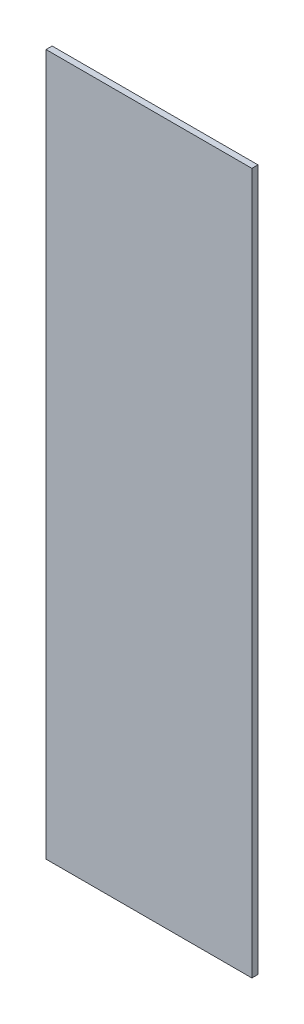
ISO-10303-21;
HEADER;
FILE_DESCRIPTION(('STEP AP214'),'2;1');
FILE_NAME('part.step','',(''),(''),'','','');
FILE_SCHEMA(('AUTOMOTIVE_DESIGN { 1 0 10303 214 1 1 1 1 }'));
ENDSEC;
DATA;
#1=APPLICATION_CONTEXT('core data for automotive mechanical design processes');
#2=APPLICATION_PROTOCOL_DEFINITION('international standard','automotive_design',2000,#1);
#3=PRODUCT_CONTEXT('',#1,'mechanical');
#4=PRODUCT('Part','Part','',(#3));
#5=PRODUCT_RELATED_PRODUCT_CATEGORY('part','',(#4));
#6=PRODUCT_DEFINITION_FORMATION('','',#4);
#7=PRODUCT_DEFINITION_CONTEXT('part definition',#1,'design');
#8=PRODUCT_DEFINITION('design','',#6,#7);
#9=PRODUCT_DEFINITION_SHAPE('','',#8);
#10=(LENGTH_UNIT() NAMED_UNIT(*) SI_UNIT(.MILLI.,.METRE.));
#11=(NAMED_UNIT(*) PLANE_ANGLE_UNIT() SI_UNIT($,.RADIAN.));
#12=(NAMED_UNIT(*) SI_UNIT($,.STERADIAN.) SOLID_ANGLE_UNIT());
#13=UNCERTAINTY_MEASURE_WITH_UNIT(LENGTH_MEASURE(1.E-05),#10,'distance_accuracy_value','');
#14=(GEOMETRIC_REPRESENTATION_CONTEXT(3) GLOBAL_UNCERTAINTY_ASSIGNED_CONTEXT((#13)) GLOBAL_UNIT_ASSIGNED_CONTEXT((#10,
#11,#12)) REPRESENTATION_CONTEXT('',''));
#15=CARTESIAN_POINT('',(0.,0.,0.));
#16=DIRECTION('',(0.,0.,1.));
#17=DIRECTION('',(1.,0.,0.));
#18=AXIS2_PLACEMENT_3D('',#15,#16,#17);
#19=CARTESIAN_POINT('',(0.67499992,-2.29941882,0.));
#20=DIRECTION('',(-1.,0.,0.));
#21=DIRECTION('',(0.,1.,0.));
#22=AXIS2_PLACEMENT_3D('',#19,#20,#21);
#23=PLANE('',#22);
#24=DIRECTION('',(0.,1.,0.));
#25=VECTOR('',#24,1.);
#26=CARTESIAN_POINT('',(0.67499992,-2.29941882,0.));
#27=LINE('',#26,#25);
#28=CARTESIAN_POINT('',(0.67499992,-2.29941882,0.));
#29=VERTEX_POINT('',#28);
#30=CARTESIAN_POINT('',(0.67499992,2.29941882,0.));
#31=VERTEX_POINT('',#30);
#32=EDGE_CURVE('E11',#29,#31,#27,.T.);
#33=ORIENTED_EDGE('',*,*,#32,.T.);
#34=DIRECTION('',(0.,0.,1.));
#35=VECTOR('',#34,1.);
#36=CARTESIAN_POINT('',(0.67499992,2.29941882,0.));
#37=LINE('',#36,#35);
#38=CARTESIAN_POINT('',(0.67499992,2.29941882,0.03999992));
#39=VERTEX_POINT('',#38);
#40=EDGE_CURVE('E24',#31,#39,#37,.T.);
#41=ORIENTED_EDGE('',*,*,#40,.T.);
#42=DIRECTION('',(0.,1.,0.));
#43=VECTOR('',#42,1.);
#44=CARTESIAN_POINT('',(0.67499992,-2.29941882,0.03999992));
#45=LINE('',#44,#43);
#46=CARTESIAN_POINT('',(0.67499992,-2.29941882,0.03999992));
#47=VERTEX_POINT('',#46);
#48=EDGE_CURVE('E87',#47,#39,#45,.T.);
#49=ORIENTED_EDGE('',*,*,#48,.F.);
#50=DIRECTION('',(0.,0.,1.));
#51=VECTOR('',#50,1.);
#52=CARTESIAN_POINT('',(0.67499992,-2.29941882,0.));
#53=LINE('',#52,#51);
#54=EDGE_CURVE('E36',#29,#47,#53,.T.);
#55=ORIENTED_EDGE('',*,*,#54,.F.);
#56=EDGE_LOOP('',(#33,#41,#49,#55));
#57=FACE_BOUND('',#56,.T.);
#58=ADVANCED_FACE('F17',(#57),#23,.F.);
#59=CARTESIAN_POINT('',(0.67499992,2.29941882,0.));
#60=DIRECTION('',(0.,-1.,0.));
#61=DIRECTION('',(-1.,0.,0.));
#62=AXIS2_PLACEMENT_3D('',#59,#60,#61);
#63=PLANE('',#62);
#64=DIRECTION('',(-1.,0.,0.));
#65=VECTOR('',#64,1.);
#66=CARTESIAN_POINT('',(0.67499992,2.29941882,0.));
#67=LINE('',#66,#65);
#68=CARTESIAN_POINT('',(-0.67499992,2.29941882,0.));
#69=VERTEX_POINT('',#68);
#70=EDGE_CURVE('E84',#31,#69,#67,.T.);
#71=ORIENTED_EDGE('',*,*,#70,.T.);
#72=DIRECTION('',(0.,0.,1.));
#73=VECTOR('',#72,1.);
#74=CARTESIAN_POINT('',(-0.67499992,2.29941882,0.));
#75=LINE('',#74,#73);
#76=CARTESIAN_POINT('',(-0.67499992,2.29941882,0.03999992));
#77=VERTEX_POINT('',#76);
#78=EDGE_CURVE('E82',#69,#77,#75,.T.);
#79=ORIENTED_EDGE('',*,*,#78,.T.);
#80=DIRECTION('',(-1.,0.,0.));
#81=VECTOR('',#80,1.);
#82=CARTESIAN_POINT('',(0.67499992,2.29941882,0.03999992));
#83=LINE('',#82,#81);
#84=EDGE_CURVE('E62',#39,#77,#83,.T.);
#85=ORIENTED_EDGE('',*,*,#84,.F.);
#86=ORIENTED_EDGE('',*,*,#40,.F.);
#87=EDGE_LOOP('',(#71,#79,#85,#86));
#88=FACE_BOUND('',#87,.T.);
#89=ADVANCED_FACE('F89',(#88),#63,.F.);
#90=CARTESIAN_POINT('',(-0.67499992,2.29941882,0.));
#91=DIRECTION('',(1.,0.,0.));
#92=DIRECTION('',(0.,-1.,0.));
#93=AXIS2_PLACEMENT_3D('',#90,#91,#92);
#94=PLANE('',#93);
#95=DIRECTION('',(0.,-1.,0.));
#96=VECTOR('',#95,1.);
#97=CARTESIAN_POINT('',(-0.67499992,2.29941882,0.));
#98=LINE('',#97,#96);
#99=CARTESIAN_POINT('',(-0.67499992,-2.29941882,0.));
#100=VERTEX_POINT('',#99);
#101=EDGE_CURVE('E71',#69,#100,#98,.T.);
#102=ORIENTED_EDGE('',*,*,#101,.T.);
#103=DIRECTION('',(0.,0.,1.));
#104=VECTOR('',#103,1.);
#105=CARTESIAN_POINT('',(-0.67499992,-2.29941882,0.));
#106=LINE('',#105,#104);
#107=CARTESIAN_POINT('',(-0.67499992,-2.29941882,0.03999992));
#108=VERTEX_POINT('',#107);
#109=EDGE_CURVE('E65',#100,#108,#106,.T.);
#110=ORIENTED_EDGE('',*,*,#109,.T.);
#111=DIRECTION('',(0.,-1.,0.));
#112=VECTOR('',#111,1.);
#113=CARTESIAN_POINT('',(-0.67499992,2.29941882,0.03999992));
#114=LINE('',#113,#112);
#115=EDGE_CURVE('E57',#77,#108,#114,.T.);
#116=ORIENTED_EDGE('',*,*,#115,.F.);
#117=ORIENTED_EDGE('',*,*,#78,.F.);
#118=EDGE_LOOP('',(#102,#110,#116,#117));
#119=FACE_BOUND('',#118,.T.);
#120=ADVANCED_FACE('F69',(#119),#94,.F.);
#121=CARTESIAN_POINT('',(-0.67499992,-2.29941882,0.));
#122=DIRECTION('',(0.,1.,0.));
#123=DIRECTION('',(1.,0.,0.));
#124=AXIS2_PLACEMENT_3D('',#121,#122,#123);
#125=PLANE('',#124);
#126=DIRECTION('',(1.,0.,0.));
#127=VECTOR('',#126,1.);
#128=CARTESIAN_POINT('',(-0.67499992,-2.29941882,0.));
#129=LINE('',#128,#127);
#130=EDGE_CURVE('E66',#100,#29,#129,.T.);
#131=ORIENTED_EDGE('',*,*,#130,.T.);
#132=ORIENTED_EDGE('',*,*,#54,.T.);
#133=DIRECTION('',(1.,0.,0.));
#134=VECTOR('',#133,1.);
#135=CARTESIAN_POINT('',(-0.67499992,-2.29941882,0.03999992));
#136=LINE('',#135,#134);
#137=EDGE_CURVE('E61',#108,#47,#136,.T.);
#138=ORIENTED_EDGE('',*,*,#137,.F.);
#139=ORIENTED_EDGE('',*,*,#109,.F.);
#140=EDGE_LOOP('',(#131,#132,#138,#139));
#141=FACE_BOUND('',#140,.T.);
#142=ADVANCED_FACE('F76',(#141),#125,.F.);
#143=CARTESIAN_POINT('',(0.,0.,0.));
#144=DIRECTION('',(0.,0.,1.));
#145=DIRECTION('',(1.,0.,0.));
#146=AXIS2_PLACEMENT_3D('',#143,#144,#145);
#147=PLANE('',#146);
#148=ORIENTED_EDGE('',*,*,#130,.F.);
#149=ORIENTED_EDGE('',*,*,#101,.F.);
#150=ORIENTED_EDGE('',*,*,#70,.F.);
#151=ORIENTED_EDGE('',*,*,#32,.F.);
#152=EDGE_LOOP('',(#148,#149,#150,#151));
#153=FACE_BOUND('',#152,.T.);
#154=ADVANCED_FACE('F91',(#153),#147,.F.);
#155=CARTESIAN_POINT('',(0.,0.,0.03999992));
#156=DIRECTION('',(0.,0.,1.));
#157=DIRECTION('',(1.,0.,0.));
#158=AXIS2_PLACEMENT_3D('',#155,#156,#157);
#159=PLANE('',#158);
#160=ORIENTED_EDGE('',*,*,#48,.T.);
#161=ORIENTED_EDGE('',*,*,#84,.T.);
#162=ORIENTED_EDGE('',*,*,#115,.T.);
#163=ORIENTED_EDGE('',*,*,#137,.T.);
#164=EDGE_LOOP('',(#160,#161,#162,#163));
#165=FACE_BOUND('',#164,.T.);
#166=ADVANCED_FACE('F59',(#165),#159,.T.);
#167=CLOSED_SHELL('',(#58,#89,#120,#142,#154,#166));
#168=MANIFOLD_SOLID_BREP('B1',#167);
#169=ADVANCED_BREP_SHAPE_REPRESENTATION('',(#18,#168),#14);
#170=SHAPE_DEFINITION_REPRESENTATION(#9,#169);
ENDSEC;
END-ISO-10303-21;
